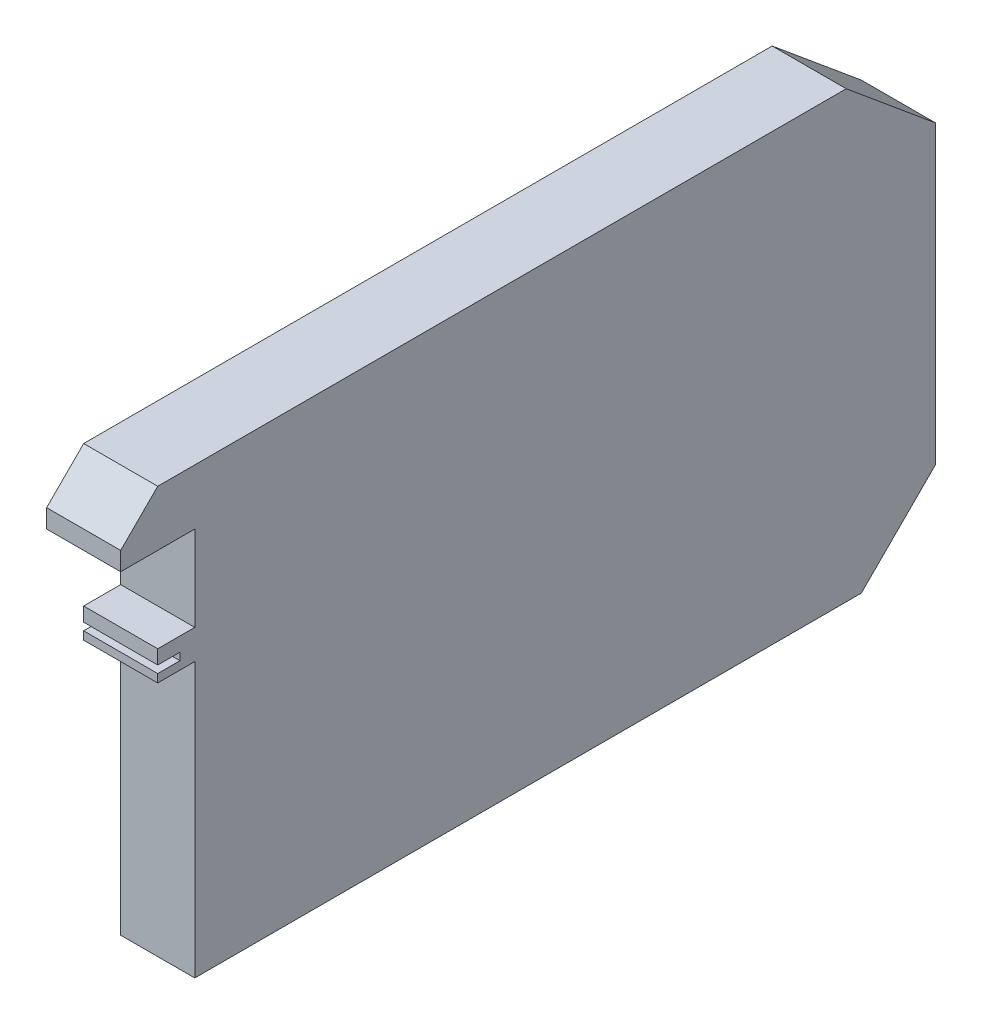
ISO-10303-21;
HEADER;
FILE_DESCRIPTION(('STEP AP214'),'2;1');
FILE_NAME('part.step','',(''),(''),'','','');
FILE_SCHEMA(('AUTOMOTIVE_DESIGN { 1 0 10303 214 1 1 1 1 }'));
ENDSEC;
DATA;
#1=APPLICATION_CONTEXT('core data for automotive mechanical design processes');
#2=APPLICATION_PROTOCOL_DEFINITION('international standard','automotive_design',2000,#1);
#3=PRODUCT_CONTEXT('',#1,'mechanical');
#4=PRODUCT('Part','Part','',(#3));
#5=PRODUCT_RELATED_PRODUCT_CATEGORY('part','',(#4));
#6=PRODUCT_DEFINITION_FORMATION('','',#4);
#7=PRODUCT_DEFINITION_CONTEXT('part definition',#1,'design');
#8=PRODUCT_DEFINITION('design','',#6,#7);
#9=PRODUCT_DEFINITION_SHAPE('','',#8);
#10=(LENGTH_UNIT() NAMED_UNIT(*) SI_UNIT(.MILLI.,.METRE.));
#11=(NAMED_UNIT(*) PLANE_ANGLE_UNIT() SI_UNIT($,.RADIAN.));
#12=(NAMED_UNIT(*) SI_UNIT($,.STERADIAN.) SOLID_ANGLE_UNIT());
#13=UNCERTAINTY_MEASURE_WITH_UNIT(LENGTH_MEASURE(1.E-05),#10,'distance_accuracy_value','');
#14=(GEOMETRIC_REPRESENTATION_CONTEXT(3) GLOBAL_UNCERTAINTY_ASSIGNED_CONTEXT((#13)) GLOBAL_UNIT_ASSIGNED_CONTEXT((#10,
#11,#12)) REPRESENTATION_CONTEXT('',''));
#15=CARTESIAN_POINT('',(0.,0.,0.));
#16=DIRECTION('',(0.,0.,1.));
#17=DIRECTION('',(1.,0.,0.));
#18=AXIS2_PLACEMENT_3D('',#15,#16,#17);
#19=CARTESIAN_POINT('',(0.,0.,27.9235082325468));
#20=DIRECTION('',(0.,0.,1.));
#21=DIRECTION('',(1.,0.,0.));
#22=AXIS2_PLACEMENT_3D('',#19,#20,#21);
#23=PLANE('',#22);
#24=DIRECTION('',(1.,0.,0.));
#25=VECTOR('',#24,1.);
#26=CARTESIAN_POINT('',(-10.,1.72283022609895,27.9235082325468));
#27=LINE('',#26,#25);
#28=CARTESIAN_POINT('',(-10.,1.72283022609895,27.9235082325468));
#29=VERTEX_POINT('',#28);
#30=CARTESIAN_POINT('',(0.,1.72283022609895,27.9235082325468));
#31=VERTEX_POINT('',#30);
#32=EDGE_CURVE('E201',#29,#31,#27,.T.);
#33=ORIENTED_EDGE('',*,*,#32,.F.);
#34=DIRECTION('',(0.,-1.,0.));
#35=VECTOR('',#34,1.);
#36=CARTESIAN_POINT('',(-10.,4.62283022609895,27.9235082325468));
#37=LINE('',#36,#35);
#38=CARTESIAN_POINT('',(-10.,0.622830226098948,27.9235082325468));
#39=VERTEX_POINT('',#38);
#40=EDGE_CURVE('E235',#29,#39,#37,.T.);
#41=ORIENTED_EDGE('',*,*,#40,.T.);
#42=DIRECTION('',(1.,0.,0.));
#43=VECTOR('',#42,1.);
#44=CARTESIAN_POINT('',(-10.,0.622830226098948,27.9235082325468));
#45=LINE('',#44,#43);
#46=CARTESIAN_POINT('',(0.,0.622830226098948,27.9235082325468));
#47=VERTEX_POINT('',#46);
#48=EDGE_CURVE('E239',#39,#47,#45,.T.);
#49=ORIENTED_EDGE('',*,*,#48,.T.);
#50=DIRECTION('',(0.,1.,0.));
#51=VECTOR('',#50,1.);
#52=CARTESIAN_POINT('',(0.,4.62283022609895,27.9235082325468));
#53=LINE('',#52,#51);
#54=EDGE_CURVE('E227',#47,#31,#53,.T.);
#55=ORIENTED_EDGE('',*,*,#54,.T.);
#56=EDGE_LOOP('',(#33,#41,#49,#55));
#57=FACE_BOUND('',#56,.T.);
#58=ADVANCED_FACE('F41',(#57),#23,.T.);
#59=CARTESIAN_POINT('',(-10.,18.6228302260989,22.9235082325468));
#60=DIRECTION('',(0.,0.,1.));
#61=DIRECTION('',(0.,-1.,0.));
#62=AXIS2_PLACEMENT_3D('',#59,#60,#61);
#63=PLANE('',#62);
#64=DIRECTION('',(0.,-1.,0.));
#65=VECTOR('',#64,1.);
#66=CARTESIAN_POINT('',(0.,18.6228302260989,22.9235082325468));
#67=LINE('',#66,#65);
#68=CARTESIAN_POINT('',(0.,16.1228302260989,22.9235082325468));
#69=VERTEX_POINT('',#68);
#70=CARTESIAN_POINT('',(0.,4.62283022609895,22.9235082325468));
#71=VERTEX_POINT('',#70);
#72=EDGE_CURVE('E306',#69,#71,#67,.T.);
#73=ORIENTED_EDGE('',*,*,#72,.F.);
#74=DIRECTION('',(-1.,0.,0.));
#75=VECTOR('',#74,1.);
#76=CARTESIAN_POINT('',(-10.,16.1228302260989,22.9235082325468));
#77=LINE('',#76,#75);
#78=CARTESIAN_POINT('',(-10.,16.1228302260989,22.9235082325468));
#79=VERTEX_POINT('',#78);
#80=EDGE_CURVE('E223',#69,#79,#77,.T.);
#81=ORIENTED_EDGE('',*,*,#80,.T.);
#82=DIRECTION('',(0.,-1.,0.));
#83=VECTOR('',#82,1.);
#84=CARTESIAN_POINT('',(-10.,18.6228302260989,22.9235082325468));
#85=LINE('',#84,#83);
#86=CARTESIAN_POINT('',(-10.,4.62283022609895,22.9235082325468));
#87=VERTEX_POINT('',#86);
#88=EDGE_CURVE('E283',#79,#87,#85,.T.);
#89=ORIENTED_EDGE('',*,*,#88,.T.);
#90=DIRECTION('',(-1.,0.,0.));
#91=VECTOR('',#90,1.);
#92=CARTESIAN_POINT('',(-10.,4.62283022609895,22.9235082325468));
#93=LINE('',#92,#91);
#94=EDGE_CURVE('E226',#71,#87,#93,.T.);
#95=ORIENTED_EDGE('',*,*,#94,.F.);
#96=EDGE_LOOP('',(#73,#81,#89,#95));
#97=FACE_BOUND('',#96,.T.);
#98=ADVANCED_FACE('F353',(#97),#63,.T.);
#99=DIRECTION('',(1.,0.,0.));
#100=VECTOR('',#99,1.);
#101=CARTESIAN_POINT('',(-10.,0.622830226098948,22.9235082325468));
#102=LINE('',#101,#100);
#103=CARTESIAN_POINT('',(-10.,0.622830226098946,22.9235082325468));
#104=VERTEX_POINT('',#103);
#105=CARTESIAN_POINT('',(0.,0.622830226098946,22.9235082325468));
#106=VERTEX_POINT('',#105);
#107=EDGE_CURVE('E246',#104,#106,#102,.T.);
#108=ORIENTED_EDGE('',*,*,#107,.F.);
#109=CARTESIAN_POINT('',(-10.,-36.3771697739011,22.9235082325467));
#110=VERTEX_POINT('',#109);
#111=EDGE_CURVE('E282',#104,#110,#85,.T.);
#112=ORIENTED_EDGE('',*,*,#111,.T.);
#113=DIRECTION('',(1.,0.,0.));
#114=VECTOR('',#113,1.);
#115=CARTESIAN_POINT('',(-10.,-36.3771697739011,22.9235082325467));
#116=LINE('',#115,#114);
#117=CARTESIAN_POINT('',(0.,-36.3771697739011,22.9235082325467));
#118=VERTEX_POINT('',#117);
#119=EDGE_CURVE('E316',#110,#118,#116,.T.);
#120=ORIENTED_EDGE('',*,*,#119,.T.);
#121=EDGE_CURVE('E305',#106,#118,#67,.T.);
#122=ORIENTED_EDGE('',*,*,#121,.F.);
#123=EDGE_LOOP('',(#108,#112,#120,#122));
#124=FACE_BOUND('',#123,.T.);
#125=ADVANCED_FACE('F386',(#124),#63,.T.);
#126=CARTESIAN_POINT('',(-10.,-26.3771697739011,-77.0764917674533));
#127=DIRECTION('',(0.,-0.707106781186548,-0.707106781186547));
#128=DIRECTION('',(0.,0.707106781186547,-0.707106781186548));
#129=AXIS2_PLACEMENT_3D('',#126,#127,#128);
#130=PLANE('',#129);
#131=DIRECTION('',(0.,0.707106781186547,-0.707106781186548));
#132=VECTOR('',#131,1.);
#133=CARTESIAN_POINT('',(0.,-26.3771697739011,-77.0764917674533));
#134=LINE('',#133,#132);
#135=CARTESIAN_POINT('',(0.,-36.3771697739011,-67.0764917674533));
#136=VERTEX_POINT('',#135);
#137=CARTESIAN_POINT('',(0.,-26.3771697739011,-77.0764917674533));
#138=VERTEX_POINT('',#137);
#139=EDGE_CURVE('E265',#136,#138,#134,.T.);
#140=ORIENTED_EDGE('',*,*,#139,.F.);
#141=DIRECTION('',(1.,0.,0.));
#142=VECTOR('',#141,1.);
#143=CARTESIAN_POINT('',(-10.,-36.3771697739011,-67.0764917674533));
#144=LINE('',#143,#142);
#145=CARTESIAN_POINT('',(-10.,-36.3771697739011,-67.0764917674533));
#146=VERTEX_POINT('',#145);
#147=EDGE_CURVE('E312',#146,#136,#144,.T.);
#148=ORIENTED_EDGE('',*,*,#147,.F.);
#149=DIRECTION('',(0.,0.707106781186547,-0.707106781186548));
#150=VECTOR('',#149,1.);
#151=CARTESIAN_POINT('',(-10.,-26.3771697739011,-77.0764917674533));
#152=LINE('',#151,#150);
#153=CARTESIAN_POINT('',(-10.,-26.3771697739011,-77.0764917674533));
#154=VERTEX_POINT('',#153);
#155=EDGE_CURVE('E266',#146,#154,#152,.T.);
#156=ORIENTED_EDGE('',*,*,#155,.T.);
#157=DIRECTION('',(1.,0.,0.));
#158=VECTOR('',#157,1.);
#159=CARTESIAN_POINT('',(-10.,-26.3771697739011,-77.0764917674533));
#160=LINE('',#159,#158);
#161=EDGE_CURVE('E290',#154,#138,#160,.T.);
#162=ORIENTED_EDGE('',*,*,#161,.T.);
#163=EDGE_LOOP('',(#140,#148,#156,#162));
#164=FACE_BOUND('',#163,.T.);
#165=ADVANCED_FACE('F378',(#164),#130,.T.);
#166=CARTESIAN_POINT('',(-10.,-36.3771697739011,22.9235082325467));
#167=DIRECTION('',(0.,-1.,0.));
#168=DIRECTION('',(0.,0.,-1.));
#169=AXIS2_PLACEMENT_3D('',#166,#167,#168);
#170=PLANE('',#169);
#171=DIRECTION('',(0.,0.,-1.));
#172=VECTOR('',#171,1.);
#173=CARTESIAN_POINT('',(0.,-36.3771697739011,22.9235082325467));
#174=LINE('',#173,#172);
#175=EDGE_CURVE('E271',#118,#136,#174,.T.);
#176=ORIENTED_EDGE('',*,*,#175,.F.);
#177=ORIENTED_EDGE('',*,*,#119,.F.);
#178=DIRECTION('',(0.,0.,-1.));
#179=VECTOR('',#178,1.);
#180=CARTESIAN_POINT('',(-10.,-36.3771697739011,22.9235082325467));
#181=LINE('',#180,#179);
#182=EDGE_CURVE('E286',#110,#146,#181,.T.);
#183=ORIENTED_EDGE('',*,*,#182,.T.);
#184=ORIENTED_EDGE('',*,*,#147,.T.);
#185=EDGE_LOOP('',(#176,#177,#183,#184));
#186=FACE_BOUND('',#185,.T.);
#187=ADVANCED_FACE('F384',(#186),#170,.T.);
#188=CARTESIAN_POINT('',(-10.,23.622830226099,-65.0412322260684));
#189=DIRECTION('',(0.,1.,0.));
#190=DIRECTION('',(0.,0.,1.));
#191=AXIS2_PLACEMENT_3D('',#188,#189,#190);
#192=PLANE('',#191);
#193=DIRECTION('',(0.,0.,1.));
#194=VECTOR('',#193,1.);
#195=CARTESIAN_POINT('',(-10.,23.622830226099,-65.0412322260684));
#196=LINE('',#195,#194);
#197=CARTESIAN_POINT('',(-10.,23.622830226099,-65.0412322260684));
#198=VERTEX_POINT('',#197);
#199=CARTESIAN_POINT('',(-10.,23.6228302260989,27.9235082325467));
#200=VERTEX_POINT('',#199);
#201=EDGE_CURVE('E279',#198,#200,#196,.T.);
#202=ORIENTED_EDGE('',*,*,#201,.T.);
#203=DIRECTION('',(1.,0.,0.));
#204=VECTOR('',#203,1.);
#205=CARTESIAN_POINT('',(-10.,23.6228302260989,27.9235082325467));
#206=LINE('',#205,#204);
#207=CARTESIAN_POINT('',(0.,23.6228302260989,27.9235082325467));
#208=VERTEX_POINT('',#207);
#209=EDGE_CURVE('E51',#200,#208,#206,.T.);
#210=ORIENTED_EDGE('',*,*,#209,.T.);
#211=DIRECTION('',(0.,0.,1.));
#212=VECTOR('',#211,1.);
#213=CARTESIAN_POINT('',(0.,23.622830226099,-65.0412322260684));
#214=LINE('',#213,#212);
#215=CARTESIAN_POINT('',(0.,23.622830226099,-65.0412322260684));
#216=VERTEX_POINT('',#215);
#217=EDGE_CURVE('E302',#216,#208,#214,.T.);
#218=ORIENTED_EDGE('',*,*,#217,.F.);
#219=DIRECTION('',(1.,0.,0.));
#220=VECTOR('',#219,1.);
#221=CARTESIAN_POINT('',(-10.,23.622830226099,-65.0412322260684));
#222=LINE('',#221,#220);
#223=EDGE_CURVE('E320',#198,#216,#222,.T.);
#224=ORIENTED_EDGE('',*,*,#223,.F.);
#225=EDGE_LOOP('',(#202,#210,#218,#224));
#226=FACE_BOUND('',#225,.T.);
#227=ADVANCED_FACE('F366',(#226),#192,.T.);
#228=CARTESIAN_POINT('',(-10.,13.6228302260989,-77.0764917674533));
#229=DIRECTION('',(0.,0.769143984780012,-0.63907552814728));
#230=DIRECTION('',(0.,0.63907552814728,0.769143984780012));
#231=AXIS2_PLACEMENT_3D('',#228,#229,#230);
#232=PLANE('',#231);
#233=DIRECTION('',(0.,0.63907552814728,0.769143984780012));
#234=VECTOR('',#233,1.);
#235=CARTESIAN_POINT('',(0.,13.6228302260989,-77.0764917674533));
#236=LINE('',#235,#234);
#237=CARTESIAN_POINT('',(0.,13.6228302260989,-77.0764917674533));
#238=VERTEX_POINT('',#237);
#239=EDGE_CURVE('E298',#238,#216,#236,.T.);
#240=ORIENTED_EDGE('',*,*,#239,.F.);
#241=DIRECTION('',(1.,0.,0.));
#242=VECTOR('',#241,1.);
#243=CARTESIAN_POINT('',(-10.,13.6228302260989,-77.0764917674533));
#244=LINE('',#243,#242);
#245=CARTESIAN_POINT('',(-10.,13.6228302260989,-77.0764917674533));
#246=VERTEX_POINT('',#245);
#247=EDGE_CURVE('E323',#246,#238,#244,.T.);
#248=ORIENTED_EDGE('',*,*,#247,.F.);
#249=DIRECTION('',(0.,0.63907552814728,0.769143984780012));
#250=VECTOR('',#249,1.);
#251=CARTESIAN_POINT('',(-10.,13.6228302260989,-77.0764917674533));
#252=LINE('',#251,#250);
#253=EDGE_CURVE('E275',#246,#198,#252,.T.);
#254=ORIENTED_EDGE('',*,*,#253,.T.);
#255=ORIENTED_EDGE('',*,*,#223,.T.);
#256=EDGE_LOOP('',(#240,#248,#254,#255));
#257=FACE_BOUND('',#256,.T.);
#258=ADVANCED_FACE('F371',(#257),#232,.T.);
#259=CARTESIAN_POINT('',(-10.,-26.3771697739011,-77.0764917674533));
#260=DIRECTION('',(0.,0.,-1.));
#261=DIRECTION('',(0.,1.,0.));
#262=AXIS2_PLACEMENT_3D('',#259,#260,#261);
#263=PLANE('',#262);
#264=DIRECTION('',(0.,1.,0.));
#265=VECTOR('',#264,1.);
#266=CARTESIAN_POINT('',(0.,-26.3771697739011,-77.0764917674533));
#267=LINE('',#266,#265);
#268=EDGE_CURVE('E294',#138,#238,#267,.T.);
#269=ORIENTED_EDGE('',*,*,#268,.F.);
#270=ORIENTED_EDGE('',*,*,#161,.F.);
#271=DIRECTION('',(0.,1.,0.));
#272=VECTOR('',#271,1.);
#273=CARTESIAN_POINT('',(-10.,-26.3771697739011,-77.0764917674533));
#274=LINE('',#273,#272);
#275=EDGE_CURVE('E270',#154,#246,#274,.T.);
#276=ORIENTED_EDGE('',*,*,#275,.T.);
#277=ORIENTED_EDGE('',*,*,#247,.T.);
#278=EDGE_LOOP('',(#269,#270,#276,#277));
#279=FACE_BOUND('',#278,.T.);
#280=ADVANCED_FACE('F375',(#279),#263,.T.);
#281=CARTESIAN_POINT('',(-10.,0.,0.));
#282=DIRECTION('',(-1.,0.,0.));
#283=DIRECTION('',(0.,0.,1.));
#284=AXIS2_PLACEMENT_3D('',#281,#282,#283);
#285=PLANE('',#284);
#286=DIRECTION('',(0.,0.,-1.));
#287=VECTOR('',#286,1.);
#288=CARTESIAN_POINT('',(-10.,1.72283022609895,27.9235082325468));
#289=LINE('',#288,#287);
#290=CARTESIAN_POINT('',(-10.,1.72283022609895,24.9235082325468));
#291=VERTEX_POINT('',#290);
#292=EDGE_CURVE('E172',#29,#291,#289,.T.);
#293=ORIENTED_EDGE('',*,*,#292,.T.);
#294=DIRECTION('',(0.,1.,0.));
#295=VECTOR('',#294,1.);
#296=CARTESIAN_POINT('',(-10.,2.72283022609895,24.9235082325468));
#297=LINE('',#296,#295);
#298=CARTESIAN_POINT('',(-10.,2.72283022609895,24.9235082325468));
#299=VERTEX_POINT('',#298);
#300=EDGE_CURVE('E166',#291,#299,#297,.T.);
#301=ORIENTED_EDGE('',*,*,#300,.T.);
#302=DIRECTION('',(0.,0.,1.));
#303=VECTOR('',#302,1.);
#304=CARTESIAN_POINT('',(-10.,2.72283022609895,27.9235082325468));
#305=LINE('',#304,#303);
#306=CARTESIAN_POINT('',(-10.,2.72283022609895,27.9235082325468));
#307=VERTEX_POINT('',#306);
#308=EDGE_CURVE('E175',#299,#307,#305,.T.);
#309=ORIENTED_EDGE('',*,*,#308,.T.);
#310=CARTESIAN_POINT('',(-10.,4.62283022609895,27.9235082325468));
#311=VERTEX_POINT('',#310);
#312=EDGE_CURVE('E236',#311,#307,#37,.T.);
#313=ORIENTED_EDGE('',*,*,#312,.F.);
#314=DIRECTION('',(0.,0.,-1.));
#315=VECTOR('',#314,1.);
#316=CARTESIAN_POINT('',(-10.,4.62283022609895,27.9235082325468));
#317=LINE('',#316,#315);
#318=EDGE_CURVE('E257',#311,#87,#317,.T.);
#319=ORIENTED_EDGE('',*,*,#318,.T.);
#320=ORIENTED_EDGE('',*,*,#88,.F.);
#321=DIRECTION('',(0.,0.,-1.));
#322=VECTOR('',#321,1.);
#323=CARTESIAN_POINT('',(-10.,16.1228302260989,32.9235082325468));
#324=LINE('',#323,#322);
#325=CARTESIAN_POINT('',(-10.,16.1228302260989,32.9235082325468));
#326=VERTEX_POINT('',#325);
#327=EDGE_CURVE('E219',#326,#79,#324,.T.);
#328=ORIENTED_EDGE('',*,*,#327,.F.);
#329=DIRECTION('',(0.,-1.,0.));
#330=VECTOR('',#329,1.);
#331=CARTESIAN_POINT('',(-10.,23.6228302260989,32.9235082325468));
#332=LINE('',#331,#330);
#333=CARTESIAN_POINT('',(-10.,18.6228302260989,32.9235082325468));
#334=VERTEX_POINT('',#333);
#335=EDGE_CURVE('E209',#334,#326,#332,.T.);
#336=ORIENTED_EDGE('',*,*,#335,.F.);
#337=DIRECTION('',(0.,-0.707106781186547,0.707106781186549));
#338=VECTOR('',#337,1.);
#339=CARTESIAN_POINT('',(-10.,25.7731692293229,25.7731692293228));
#340=LINE('',#339,#338);
#341=EDGE_CURVE('E331',#334,#200,#340,.F.);
#342=ORIENTED_EDGE('',*,*,#341,.T.);
#343=ORIENTED_EDGE('',*,*,#201,.F.);
#344=ORIENTED_EDGE('',*,*,#253,.F.);
#345=ORIENTED_EDGE('',*,*,#275,.F.);
#346=ORIENTED_EDGE('',*,*,#155,.F.);
#347=ORIENTED_EDGE('',*,*,#182,.F.);
#348=ORIENTED_EDGE('',*,*,#111,.F.);
#349=DIRECTION('',(0.,0.,-1.));
#350=VECTOR('',#349,1.);
#351=CARTESIAN_POINT('',(-10.,0.622830226098948,27.9235082325468));
#352=LINE('',#351,#350);
#353=EDGE_CURVE('E253',#39,#104,#352,.T.);
#354=ORIENTED_EDGE('',*,*,#353,.F.);
#355=ORIENTED_EDGE('',*,*,#40,.F.);
#356=EDGE_LOOP('',(#293,#301,#309,#313,#319,#320,#328,#336,#342,#343,#344,#345,#346,#347,#348,
#354,#355));
#357=FACE_BOUND('',#356,.T.);
#358=ADVANCED_FACE('F182',(#357),#285,.T.);
#359=CARTESIAN_POINT('',(0.,0.,0.));
#360=DIRECTION('',(-1.,0.,0.));
#361=DIRECTION('',(0.,0.,1.));
#362=AXIS2_PLACEMENT_3D('',#359,#360,#361);
#363=PLANE('',#362);
#364=DIRECTION('',(0.,1.,0.));
#365=VECTOR('',#364,1.);
#366=CARTESIAN_POINT('',(0.,2.72283022609895,24.9235082325468));
#367=LINE('',#366,#365);
#368=CARTESIAN_POINT('',(0.,1.72283022609895,24.9235082325468));
#369=VERTEX_POINT('',#368);
#370=CARTESIAN_POINT('',(0.,2.72283022609895,24.9235082325468));
#371=VERTEX_POINT('',#370);
#372=EDGE_CURVE('E169',#369,#371,#367,.T.);
#373=ORIENTED_EDGE('',*,*,#372,.F.);
#374=DIRECTION('',(0.,0.,-1.));
#375=VECTOR('',#374,1.);
#376=CARTESIAN_POINT('',(0.,1.72283022609895,27.9235082325468));
#377=LINE('',#376,#375);
#378=EDGE_CURVE('E185',#31,#369,#377,.T.);
#379=ORIENTED_EDGE('',*,*,#378,.F.);
#380=ORIENTED_EDGE('',*,*,#54,.F.);
#381=DIRECTION('',(0.,0.,-1.));
#382=VECTOR('',#381,1.);
#383=CARTESIAN_POINT('',(0.,0.622830226098948,27.9235082325468));
#384=LINE('',#383,#382);
#385=EDGE_CURVE('E242',#47,#106,#384,.T.);
#386=ORIENTED_EDGE('',*,*,#385,.T.);
#387=ORIENTED_EDGE('',*,*,#121,.T.);
#388=ORIENTED_EDGE('',*,*,#175,.T.);
#389=ORIENTED_EDGE('',*,*,#139,.T.);
#390=ORIENTED_EDGE('',*,*,#268,.T.);
#391=ORIENTED_EDGE('',*,*,#239,.T.);
#392=ORIENTED_EDGE('',*,*,#217,.T.);
#393=DIRECTION('',(0.,0.707106781186547,-0.707106781186549));
#394=VECTOR('',#393,1.);
#395=CARTESIAN_POINT('',(0.,18.6228302260989,32.9235082325468));
#396=LINE('',#395,#394);
#397=CARTESIAN_POINT('',(0.,18.6228302260989,32.9235082325468));
#398=VERTEX_POINT('',#397);
#399=EDGE_CURVE('E11',#208,#398,#396,.F.);
#400=ORIENTED_EDGE('',*,*,#399,.T.);
#401=DIRECTION('',(0.,1.,0.));
#402=VECTOR('',#401,1.);
#403=CARTESIAN_POINT('',(0.,23.6228302260989,32.9235082325468));
#404=LINE('',#403,#402);
#405=CARTESIAN_POINT('',(0.,16.1228302260989,32.9235082325468));
#406=VERTEX_POINT('',#405);
#407=EDGE_CURVE('E200',#406,#398,#404,.T.);
#408=ORIENTED_EDGE('',*,*,#407,.F.);
#409=DIRECTION('',(0.,0.,-1.));
#410=VECTOR('',#409,1.);
#411=CARTESIAN_POINT('',(0.,16.1228302260989,32.9235082325468));
#412=LINE('',#411,#410);
#413=EDGE_CURVE('E215',#406,#69,#412,.T.);
#414=ORIENTED_EDGE('',*,*,#413,.T.);
#415=ORIENTED_EDGE('',*,*,#72,.T.);
#416=DIRECTION('',(0.,0.,-1.));
#417=VECTOR('',#416,1.);
#418=CARTESIAN_POINT('',(0.,4.62283022609895,27.9235082325468));
#419=LINE('',#418,#417);
#420=CARTESIAN_POINT('',(0.,4.62283022609895,27.9235082325468));
#421=VERTEX_POINT('',#420);
#422=EDGE_CURVE('E261',#421,#71,#419,.T.);
#423=ORIENTED_EDGE('',*,*,#422,.F.);
#424=CARTESIAN_POINT('',(0.,2.72283022609895,27.9235082325468));
#425=VERTEX_POINT('',#424);
#426=EDGE_CURVE('E232',#425,#421,#53,.T.);
#427=ORIENTED_EDGE('',*,*,#426,.F.);
#428=DIRECTION('',(0.,0.,1.));
#429=VECTOR('',#428,1.);
#430=CARTESIAN_POINT('',(0.,2.72283022609895,27.9235082325468));
#431=LINE('',#430,#429);
#432=EDGE_CURVE('E58',#371,#425,#431,.T.);
#433=ORIENTED_EDGE('',*,*,#432,.F.);
#434=EDGE_LOOP('',(#373,#379,#380,#386,#387,#388,#389,#390,#391,#392,#400,#408,#414,#415,#423,
#427,#433));
#435=FACE_BOUND('',#434,.T.);
#436=ADVANCED_FACE('F347',(#435),#363,.F.);
#437=CARTESIAN_POINT('',(-10.,4.62283022609895,27.9235082325468));
#438=DIRECTION('',(0.,-1.,0.));
#439=DIRECTION('',(0.,0.,-1.));
#440=AXIS2_PLACEMENT_3D('',#437,#438,#439);
#441=PLANE('',#440);
#442=ORIENTED_EDGE('',*,*,#94,.T.);
#443=ORIENTED_EDGE('',*,*,#318,.F.);
#444=DIRECTION('',(-1.,0.,0.));
#445=VECTOR('',#444,1.);
#446=CARTESIAN_POINT('',(-10.,4.62283022609895,27.9235082325468));
#447=LINE('',#446,#445);
#448=EDGE_CURVE('E231',#421,#311,#447,.T.);
#449=ORIENTED_EDGE('',*,*,#448,.F.);
#450=ORIENTED_EDGE('',*,*,#422,.T.);
#451=EDGE_LOOP('',(#442,#443,#449,#450));
#452=FACE_BOUND('',#451,.T.);
#453=ADVANCED_FACE('F346',(#452),#441,.F.);
#454=CARTESIAN_POINT('',(-10.,0.622830226098948,27.9235082325468));
#455=DIRECTION('',(0.,1.,0.));
#456=DIRECTION('',(0.,0.,1.));
#457=AXIS2_PLACEMENT_3D('',#454,#455,#456);
#458=PLANE('',#457);
#459=ORIENTED_EDGE('',*,*,#107,.T.);
#460=ORIENTED_EDGE('',*,*,#385,.F.);
#461=ORIENTED_EDGE('',*,*,#48,.F.);
#462=ORIENTED_EDGE('',*,*,#353,.T.);
#463=EDGE_LOOP('',(#459,#460,#461,#462));
#464=FACE_BOUND('',#463,.T.);
#465=ADVANCED_FACE('F390',(#464),#458,.F.);
#466=DIRECTION('',(1.,0.,0.));
#467=VECTOR('',#466,1.);
#468=CARTESIAN_POINT('',(-10.,2.72283022609895,27.9235082325468));
#469=LINE('',#468,#467);
#470=EDGE_CURVE('E171',#307,#425,#469,.T.);
#471=ORIENTED_EDGE('',*,*,#470,.T.);
#472=ORIENTED_EDGE('',*,*,#426,.T.);
#473=ORIENTED_EDGE('',*,*,#448,.T.);
#474=ORIENTED_EDGE('',*,*,#312,.T.);
#475=EDGE_LOOP('',(#471,#472,#473,#474));
#476=FACE_BOUND('',#475,.T.);
#477=ADVANCED_FACE('F341',(#476),#23,.T.);
#478=CARTESIAN_POINT('',(-10.,16.1228302260989,32.9235082325468));
#479=DIRECTION('',(0.,1.,0.));
#480=DIRECTION('',(0.,0.,1.));
#481=AXIS2_PLACEMENT_3D('',#478,#479,#480);
#482=PLANE('',#481);
#483=ORIENTED_EDGE('',*,*,#80,.F.);
#484=ORIENTED_EDGE('',*,*,#413,.F.);
#485=DIRECTION('',(1.,0.,0.));
#486=VECTOR('',#485,1.);
#487=CARTESIAN_POINT('',(-10.,16.1228302260989,32.9235082325468));
#488=LINE('',#487,#486);
#489=EDGE_CURVE('E212',#326,#406,#488,.T.);
#490=ORIENTED_EDGE('',*,*,#489,.F.);
#491=ORIENTED_EDGE('',*,*,#327,.T.);
#492=EDGE_LOOP('',(#483,#484,#490,#491));
#493=FACE_BOUND('',#492,.T.);
#494=ADVANCED_FACE('F359',(#493),#482,.F.);
#495=CARTESIAN_POINT('',(0.,0.,32.9235082325468));
#496=DIRECTION('',(0.,0.,1.));
#497=DIRECTION('',(1.,0.,0.));
#498=AXIS2_PLACEMENT_3D('',#495,#496,#497);
#499=PLANE('',#498);
#500=ORIENTED_EDGE('',*,*,#407,.T.);
#501=DIRECTION('',(-1.,0.,0.));
#502=VECTOR('',#501,1.);
#503=CARTESIAN_POINT('',(0.,18.6228302260989,32.9235082325468));
#504=LINE('',#503,#502);
#505=EDGE_CURVE('E315',#398,#334,#504,.T.);
#506=ORIENTED_EDGE('',*,*,#505,.T.);
#507=ORIENTED_EDGE('',*,*,#335,.T.);
#508=ORIENTED_EDGE('',*,*,#489,.T.);
#509=EDGE_LOOP('',(#500,#506,#507,#508));
#510=FACE_BOUND('',#509,.T.);
#511=ADVANCED_FACE('F361',(#510),#499,.T.);
#512=CARTESIAN_POINT('',(0.,18.6228302260989,32.9235082325468));
#513=DIRECTION('',(0.,-0.707106781186549,-0.707106781186547));
#514=DIRECTION('',(-1.,0.,0.));
#515=AXIS2_PLACEMENT_3D('',#512,#513,#514);
#516=PLANE('',#515);
#517=ORIENTED_EDGE('',*,*,#399,.F.);
#518=ORIENTED_EDGE('',*,*,#209,.F.);
#519=ORIENTED_EDGE('',*,*,#341,.F.);
#520=ORIENTED_EDGE('',*,*,#505,.F.);
#521=EDGE_LOOP('',(#517,#518,#519,#520));
#522=FACE_BOUND('',#521,.T.);
#523=ADVANCED_FACE('F44',(#522),#516,.F.);
#524=CARTESIAN_POINT('',(-10.,2.72283022609895,24.9235082325468));
#525=DIRECTION('',(0.,0.,-1.));
#526=DIRECTION('',(-1.,0.,0.));
#527=AXIS2_PLACEMENT_3D('',#524,#525,#526);
#528=PLANE('',#527);
#529=ORIENTED_EDGE('',*,*,#372,.T.);
#530=DIRECTION('',(1.,0.,0.));
#531=VECTOR('',#530,1.);
#532=CARTESIAN_POINT('',(-10.,2.72283022609895,24.9235082325468));
#533=LINE('',#532,#531);
#534=EDGE_CURVE('E162',#299,#371,#533,.T.);
#535=ORIENTED_EDGE('',*,*,#534,.F.);
#536=ORIENTED_EDGE('',*,*,#300,.F.);
#537=DIRECTION('',(1.,0.,0.));
#538=VECTOR('',#537,1.);
#539=CARTESIAN_POINT('',(-10.,1.72283022609895,24.9235082325468));
#540=LINE('',#539,#538);
#541=EDGE_CURVE('E197',#291,#369,#540,.T.);
#542=ORIENTED_EDGE('',*,*,#541,.T.);
#543=EDGE_LOOP('',(#529,#535,#536,#542));
#544=FACE_BOUND('',#543,.T.);
#545=ADVANCED_FACE('F164',(#544),#528,.F.);
#546=CARTESIAN_POINT('',(-10.,1.72283022609895,27.9235082325468));
#547=DIRECTION('',(0.,-1.,0.));
#548=DIRECTION('',(0.,0.,-1.));
#549=AXIS2_PLACEMENT_3D('',#546,#547,#548);
#550=PLANE('',#549);
#551=ORIENTED_EDGE('',*,*,#378,.T.);
#552=ORIENTED_EDGE('',*,*,#541,.F.);
#553=ORIENTED_EDGE('',*,*,#292,.F.);
#554=ORIENTED_EDGE('',*,*,#32,.T.);
#555=EDGE_LOOP('',(#551,#552,#553,#554));
#556=FACE_BOUND('',#555,.T.);
#557=ADVANCED_FACE('F397',(#556),#550,.F.);
#558=CARTESIAN_POINT('',(-10.,2.72283022609895,27.9235082325468));
#559=DIRECTION('',(0.,1.,0.));
#560=DIRECTION('',(0.,0.,1.));
#561=AXIS2_PLACEMENT_3D('',#558,#559,#560);
#562=PLANE('',#561);
#563=ORIENTED_EDGE('',*,*,#432,.T.);
#564=ORIENTED_EDGE('',*,*,#470,.F.);
#565=ORIENTED_EDGE('',*,*,#308,.F.);
#566=ORIENTED_EDGE('',*,*,#534,.T.);
#567=EDGE_LOOP('',(#563,#564,#565,#566));
#568=FACE_BOUND('',#567,.T.);
#569=ADVANCED_FACE('F176',(#568),#562,.F.);
#570=CLOSED_SHELL('',(#58,#98,#125,#165,#187,#227,#258,#280,#358,#436,#453,#465,#477,#494,#511,
#523,#545,#557,#569));
#571=MANIFOLD_SOLID_BREP('B2',#570);
#572=ADVANCED_BREP_SHAPE_REPRESENTATION('',(#18,#571),#14);
#573=SHAPE_DEFINITION_REPRESENTATION(#9,#572);
ENDSEC;
END-ISO-10303-21;
